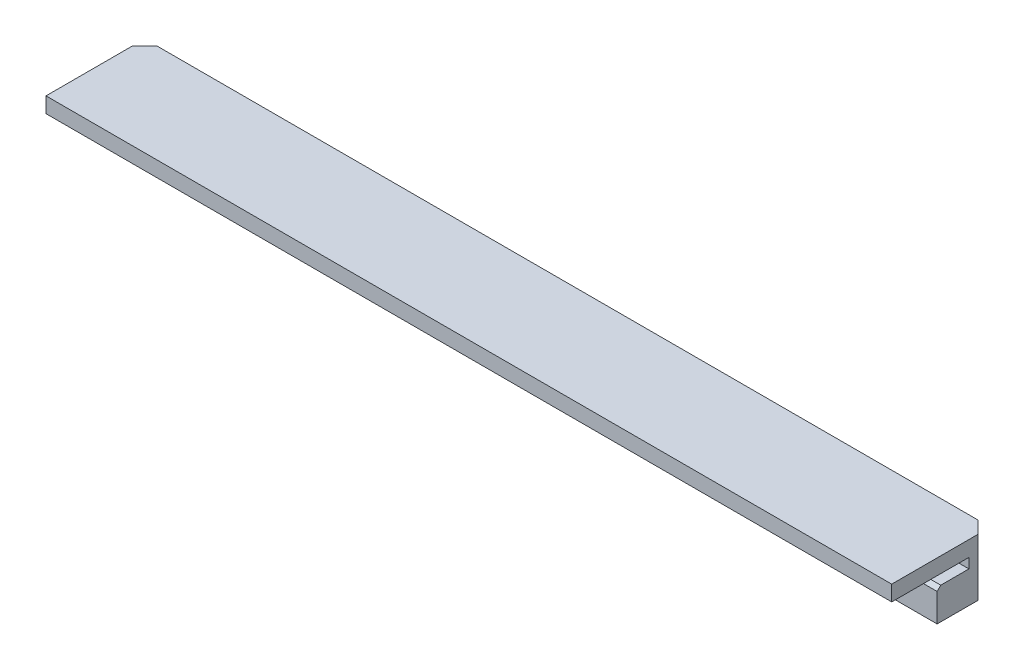
ISO-10303-21;
HEADER;
FILE_DESCRIPTION(('STEP AP214'),'2;1');
FILE_NAME('part.step','',(''),(''),'','','');
FILE_SCHEMA(('AUTOMOTIVE_DESIGN { 1 0 10303 214 1 1 1 1 }'));
ENDSEC;
DATA;
#1=APPLICATION_CONTEXT('core data for automotive mechanical design processes');
#2=APPLICATION_PROTOCOL_DEFINITION('international standard','automotive_design',2000,#1);
#3=PRODUCT_CONTEXT('',#1,'mechanical');
#4=PRODUCT('Part','Part','',(#3));
#5=PRODUCT_RELATED_PRODUCT_CATEGORY('part','',(#4));
#6=PRODUCT_DEFINITION_FORMATION('','',#4);
#7=PRODUCT_DEFINITION_CONTEXT('part definition',#1,'design');
#8=PRODUCT_DEFINITION('design','',#6,#7);
#9=PRODUCT_DEFINITION_SHAPE('','',#8);
#10=(LENGTH_UNIT() NAMED_UNIT(*) SI_UNIT(.MILLI.,.METRE.));
#11=(NAMED_UNIT(*) PLANE_ANGLE_UNIT() SI_UNIT($,.RADIAN.));
#12=(NAMED_UNIT(*) SI_UNIT($,.STERADIAN.) SOLID_ANGLE_UNIT());
#13=UNCERTAINTY_MEASURE_WITH_UNIT(LENGTH_MEASURE(1.E-05),#10,'distance_accuracy_value','');
#14=(GEOMETRIC_REPRESENTATION_CONTEXT(3) GLOBAL_UNCERTAINTY_ASSIGNED_CONTEXT((#13)) GLOBAL_UNIT_ASSIGNED_CONTEXT((#10,
#11,#12)) REPRESENTATION_CONTEXT('',''));
#15=CARTESIAN_POINT('',(0.,0.,0.));
#16=DIRECTION('',(0.,0.,1.));
#17=DIRECTION('',(1.,0.,0.));
#18=AXIS2_PLACEMENT_3D('',#15,#16,#17);
#19=CARTESIAN_POINT('',(0.,3.5,0.));
#20=DIRECTION('',(1.,0.,0.));
#21=DIRECTION('',(0.,0.,-1.));
#22=AXIS2_PLACEMENT_3D('',#19,#20,#21);
#23=PLANE('',#22);
#24=DIRECTION('',(0.,-1.,0.));
#25=VECTOR('',#24,1.);
#26=CARTESIAN_POINT('',(0.,6.301,-4.5));
#27=LINE('',#26,#25);
#28=CARTESIAN_POINT('',(0.,6.3,-4.5));
#29=VERTEX_POINT('',#28);
#30=CARTESIAN_POINT('',(0.,0.,-4.5));
#31=VERTEX_POINT('',#30);
#32=EDGE_CURVE('E167',#29,#31,#27,.T.);
#33=ORIENTED_EDGE('',*,*,#32,.T.);
#34=DIRECTION('',(0.,0.,1.));
#35=VECTOR('',#34,1.);
#36=CARTESIAN_POINT('',(0.,0.,0.));
#37=LINE('',#36,#35);
#38=CARTESIAN_POINT('',(0.,0.,0.));
#39=VERTEX_POINT('',#38);
#40=EDGE_CURVE('E177',#31,#39,#37,.T.);
#41=ORIENTED_EDGE('',*,*,#40,.T.);
#42=DIRECTION('',(0.,-1.,0.));
#43=VECTOR('',#42,1.);
#44=CARTESIAN_POINT('',(0.,3.5,0.));
#45=LINE('',#44,#43);
#46=CARTESIAN_POINT('',(0.,3.1,0.));
#47=VERTEX_POINT('',#46);
#48=EDGE_CURVE('E205',#47,#39,#45,.T.);
#49=ORIENTED_EDGE('',*,*,#48,.F.);
#50=DIRECTION('',(0.,-0.70710678118656,0.707106781186535));
#51=VECTOR('',#50,1.);
#52=CARTESIAN_POINT('',(0.,3.5,-0.399999999999984));
#53=LINE('',#52,#51);
#54=CARTESIAN_POINT('',(0.,3.5,-0.399999999999984));
#55=VERTEX_POINT('',#54);
#56=EDGE_CURVE('E215',#47,#55,#53,.F.);
#57=ORIENTED_EDGE('',*,*,#56,.T.);
#58=DIRECTION('',(0.,0.,1.));
#59=VECTOR('',#58,1.);
#60=CARTESIAN_POINT('',(0.,3.5,0.));
#61=LINE('',#60,#59);
#62=CARTESIAN_POINT('',(0.,3.5,-3.5));
#63=VERTEX_POINT('',#62);
#64=EDGE_CURVE('E201',#63,#55,#61,.T.);
#65=ORIENTED_EDGE('',*,*,#64,.F.);
#66=DIRECTION('',(0.,-1.,0.));
#67=VECTOR('',#66,1.);
#68=CARTESIAN_POINT('',(0.,4.6,-3.5));
#69=LINE('',#68,#67);
#70=CARTESIAN_POINT('',(0.,4.6,-3.5));
#71=VERTEX_POINT('',#70);
#72=EDGE_CURVE('E188',#71,#63,#69,.T.);
#73=ORIENTED_EDGE('',*,*,#72,.F.);
#74=DIRECTION('',(0.,0.,1.));
#75=VECTOR('',#74,1.);
#76=CARTESIAN_POINT('',(0.,4.6,-10.));
#77=LINE('',#76,#75);
#78=CARTESIAN_POINT('',(0.,4.6,5.));
#79=VERTEX_POINT('',#78);
#80=EDGE_CURVE('E257',#71,#79,#77,.T.);
#81=ORIENTED_EDGE('',*,*,#80,.T.);
#82=DIRECTION('',(0.,-1.,0.));
#83=VECTOR('',#82,1.);
#84=CARTESIAN_POINT('',(0.,4.6,5.));
#85=LINE('',#84,#83);
#86=CARTESIAN_POINT('',(0.,6.3,5.));
#87=VERTEX_POINT('',#86);
#88=EDGE_CURVE('E287',#87,#79,#85,.T.);
#89=ORIENTED_EDGE('',*,*,#88,.F.);
#90=DIRECTION('',(0.,0.,1.));
#91=VECTOR('',#90,1.);
#92=CARTESIAN_POINT('',(0.,6.3,5.));
#93=LINE('',#92,#91);
#94=EDGE_CURVE('E180',#29,#87,#93,.T.);
#95=ORIENTED_EDGE('',*,*,#94,.F.);
#96=EDGE_LOOP('',(#33,#41,#49,#57,#65,#73,#81,#89,#95));
#97=FACE_BOUND('',#96,.T.);
#98=ADVANCED_FACE('F41',(#97),#23,.F.);
#99=CARTESIAN_POINT('',(93.1,3.5,0.));
#100=DIRECTION('',(-1.,0.,0.));
#101=DIRECTION('',(0.,0.,1.));
#102=AXIS2_PLACEMENT_3D('',#99,#100,#101);
#103=PLANE('',#102);
#104=DIRECTION('',(0.,-1.,0.));
#105=VECTOR('',#104,1.);
#106=CARTESIAN_POINT('',(93.1,6.301,-4.50000000000001));
#107=LINE('',#106,#105);
#108=CARTESIAN_POINT('',(93.1,6.3,-4.50000000000001));
#109=VERTEX_POINT('',#108);
#110=CARTESIAN_POINT('',(93.1,0.,-4.50000000000001));
#111=VERTEX_POINT('',#110);
#112=EDGE_CURVE('E312',#109,#111,#107,.T.);
#113=ORIENTED_EDGE('',*,*,#112,.F.);
#114=DIRECTION('',(0.,0.,-1.));
#115=VECTOR('',#114,1.);
#116=CARTESIAN_POINT('',(93.1,6.3,5.));
#117=LINE('',#116,#115);
#118=CARTESIAN_POINT('',(93.1,6.3,5.));
#119=VERTEX_POINT('',#118);
#120=EDGE_CURVE('E298',#119,#109,#117,.T.);
#121=ORIENTED_EDGE('',*,*,#120,.F.);
#122=DIRECTION('',(0.,1.,0.));
#123=VECTOR('',#122,1.);
#124=CARTESIAN_POINT('',(93.1,4.6,5.));
#125=LINE('',#124,#123);
#126=CARTESIAN_POINT('',(93.1,4.6,5.));
#127=VERTEX_POINT('',#126);
#128=EDGE_CURVE('E284',#127,#119,#125,.T.);
#129=ORIENTED_EDGE('',*,*,#128,.F.);
#130=DIRECTION('',(0.,0.,-1.));
#131=VECTOR('',#130,1.);
#132=CARTESIAN_POINT('',(93.1,4.6,-10.));
#133=LINE('',#132,#131);
#134=CARTESIAN_POINT('',(93.1,4.6,-3.5));
#135=VERTEX_POINT('',#134);
#136=EDGE_CURVE('E254',#127,#135,#133,.T.);
#137=ORIENTED_EDGE('',*,*,#136,.T.);
#138=DIRECTION('',(0.,-1.,0.));
#139=VECTOR('',#138,1.);
#140=CARTESIAN_POINT('',(93.1,4.6,-3.5));
#141=LINE('',#140,#139);
#142=CARTESIAN_POINT('',(93.1,3.5,-3.5));
#143=VERTEX_POINT('',#142);
#144=EDGE_CURVE('E192',#135,#143,#141,.T.);
#145=ORIENTED_EDGE('',*,*,#144,.T.);
#146=DIRECTION('',(0.,0.,-1.));
#147=VECTOR('',#146,1.);
#148=CARTESIAN_POINT('',(93.1,3.5,0.));
#149=LINE('',#148,#147);
#150=CARTESIAN_POINT('',(93.1,3.5,-0.399999999999984));
#151=VERTEX_POINT('',#150);
#152=EDGE_CURVE('E195',#151,#143,#149,.T.);
#153=ORIENTED_EDGE('',*,*,#152,.F.);
#154=DIRECTION('',(0.,0.70710678118656,-0.707106781186535));
#155=VECTOR('',#154,1.);
#156=CARTESIAN_POINT('',(93.1,3.5,-0.399999999999984));
#157=LINE('',#156,#155);
#158=CARTESIAN_POINT('',(93.1,3.1,0.));
#159=VERTEX_POINT('',#158);
#160=EDGE_CURVE('E220',#151,#159,#157,.F.);
#161=ORIENTED_EDGE('',*,*,#160,.T.);
#162=DIRECTION('',(0.,-1.,0.));
#163=VECTOR('',#162,1.);
#164=CARTESIAN_POINT('',(93.1,3.5,0.));
#165=LINE('',#164,#163);
#166=CARTESIAN_POINT('',(93.1,0.,0.));
#167=VERTEX_POINT('',#166);
#168=EDGE_CURVE('E202',#159,#167,#165,.T.);
#169=ORIENTED_EDGE('',*,*,#168,.T.);
#170=DIRECTION('',(0.,0.,-1.));
#171=VECTOR('',#170,1.);
#172=CARTESIAN_POINT('',(93.1,0.,0.));
#173=LINE('',#172,#171);
#174=EDGE_CURVE('E198',#167,#111,#173,.T.);
#175=ORIENTED_EDGE('',*,*,#174,.T.);
#176=EDGE_LOOP('',(#113,#121,#129,#137,#145,#153,#161,#169,#175));
#177=FACE_BOUND('',#176,.T.);
#178=ADVANCED_FACE('F324',(#177),#103,.F.);
#179=CARTESIAN_POINT('',(0.,0.,0.));
#180=DIRECTION('',(0.,-1.,0.));
#181=DIRECTION('',(0.,0.,-1.));
#182=AXIS2_PLACEMENT_3D('',#179,#180,#181);
#183=PLANE('',#182);
#184=ORIENTED_EDGE('',*,*,#40,.F.);
#185=DIRECTION('',(0.707106781186548,0.,-0.707106781186548));
#186=VECTOR('',#185,1.);
#187=CARTESIAN_POINT('',(5.,0.,-9.5));
#188=LINE('',#187,#186);
#189=CARTESIAN_POINT('',(5.,0.,-9.5));
#190=VERTEX_POINT('',#189);
#191=EDGE_CURVE('E164',#31,#190,#188,.T.);
#192=ORIENTED_EDGE('',*,*,#191,.T.);
#193=DIRECTION('',(1.,0.,0.));
#194=VECTOR('',#193,1.);
#195=CARTESIAN_POINT('',(-0.001000000000001,0.,-9.5));
#196=LINE('',#195,#194);
#197=CARTESIAN_POINT('',(88.1,0.,-9.5));
#198=VERTEX_POINT('',#197);
#199=EDGE_CURVE('E301',#190,#198,#196,.T.);
#200=ORIENTED_EDGE('',*,*,#199,.T.);
#201=DIRECTION('',(0.707106781186547,0.,0.707106781186548));
#202=VECTOR('',#201,1.);
#203=CARTESIAN_POINT('',(88.1,0.,-9.50000000000001));
#204=LINE('',#203,#202);
#205=EDGE_CURVE('E57',#198,#111,#204,.T.);
#206=ORIENTED_EDGE('',*,*,#205,.T.);
#207=ORIENTED_EDGE('',*,*,#174,.F.);
#208=DIRECTION('',(1.,0.,0.));
#209=VECTOR('',#208,1.);
#210=CARTESIAN_POINT('',(0.,0.,0.));
#211=LINE('',#210,#209);
#212=CARTESIAN_POINT('',(76.399623113199,0.,0.));
#213=VERTEX_POINT('',#212);
#214=EDGE_CURVE('E187',#213,#167,#211,.T.);
#215=ORIENTED_EDGE('',*,*,#214,.F.);
#216=CARTESIAN_POINT('',(46.55,0.,147.));
#217=DIRECTION('',(0.,-1.,0.));
#218=DIRECTION('',(0.,0.,-1.));
#219=AXIS2_PLACEMENT_3D('',#216,#217,#218);
#220=CIRCLE('',#219,150.);
#221=CARTESIAN_POINT('',(16.7003768868009,0.,0.));
#222=VERTEX_POINT('',#221);
#223=EDGE_CURVE('E273',#222,#213,#220,.T.);
#224=ORIENTED_EDGE('',*,*,#223,.F.);
#225=EDGE_CURVE('E186',#39,#222,#211,.T.);
#226=ORIENTED_EDGE('',*,*,#225,.F.);
#227=EDGE_LOOP('',(#184,#192,#200,#206,#207,#215,#224,#226));
#228=FACE_BOUND('',#227,.T.);
#229=ADVANCED_FACE('F183',(#228),#183,.T.);
#230=CARTESIAN_POINT('',(-0.001000000000001,6.3,5.));
#231=DIRECTION('',(0.,-1.,0.));
#232=DIRECTION('',(0.,0.,-1.));
#233=AXIS2_PLACEMENT_3D('',#230,#231,#232);
#234=PLANE('',#233);
#235=DIRECTION('',(-0.707106781186548,0.,0.707106781186548));
#236=VECTOR('',#235,1.);
#237=CARTESIAN_POINT('',(5.,6.3,-9.5));
#238=LINE('',#237,#236);
#239=CARTESIAN_POINT('',(1.36269330410541,6.3,-5.86269330410541));
#240=VERTEX_POINT('',#239);
#241=EDGE_CURVE('E65',#240,#29,#238,.T.);
#242=ORIENTED_EDGE('',*,*,#241,.T.);
#243=ORIENTED_EDGE('',*,*,#94,.T.);
#244=DIRECTION('',(1.,0.,0.));
#245=VECTOR('',#244,1.);
#246=CARTESIAN_POINT('',(-0.001000000000001,6.3,5.));
#247=LINE('',#246,#245);
#248=EDGE_CURVE('E296',#87,#119,#247,.T.);
#249=ORIENTED_EDGE('',*,*,#248,.T.);
#250=ORIENTED_EDGE('',*,*,#120,.T.);
#251=DIRECTION('',(-0.707106781186547,0.,-0.707106781186548));
#252=VECTOR('',#251,1.);
#253=CARTESIAN_POINT('',(88.1,6.3,-9.50000000000001));
#254=LINE('',#253,#252);
#255=CARTESIAN_POINT('',(91.7373066958946,6.3,-5.86269330410541));
#256=VERTEX_POINT('',#255);
#257=EDGE_CURVE('E308',#109,#256,#254,.T.);
#258=ORIENTED_EDGE('',*,*,#257,.T.);
#259=DIRECTION('',(1.,0.,0.));
#260=VECTOR('',#259,1.);
#261=CARTESIAN_POINT('',(-0.001000000000001,6.3,-5.86269330410541));
#262=LINE('',#261,#260);
#263=EDGE_CURVE('E302',#240,#256,#262,.T.);
#264=ORIENTED_EDGE('',*,*,#263,.F.);
#265=EDGE_LOOP('',(#242,#243,#249,#250,#258,#264));
#266=FACE_BOUND('',#265,.T.);
#267=ADVANCED_FACE('F319',(#266),#234,.F.);
#268=CARTESIAN_POINT('',(-0.001000000000001,6.3,-5.86269330410541));
#269=DIRECTION('',(0.,-0.499999999999995,0.866025403784442));
#270=DIRECTION('',(0.,-0.866025403784442,-0.499999999999995));
#271=AXIS2_PLACEMENT_3D('',#268,#269,#270);
#272=PLANE('',#271);
#273=DIRECTION('',(-0.447213595499954,0.774596669241488,0.447213595499954));
#274=VECTOR('',#273,1.);
#275=CARTESIAN_POINT('',(2.81726957230171,3.78060000000004,-7.31726957230171));
#276=LINE('',#275,#274);
#277=EDGE_CURVE('E168',#190,#240,#276,.T.);
#278=ORIENTED_EDGE('',*,*,#277,.T.);
#279=ORIENTED_EDGE('',*,*,#263,.T.);
#280=DIRECTION('',(-0.447213595499954,-0.774596669241488,-0.447213595499954));
#281=VECTOR('',#280,1.);
#282=CARTESIAN_POINT('',(90.2827304276983,3.78060000000004,-7.31726957230171));
#283=LINE('',#282,#281);
#284=EDGE_CURVE('E306',#256,#198,#283,.T.);
#285=ORIENTED_EDGE('',*,*,#284,.T.);
#286=ORIENTED_EDGE('',*,*,#199,.F.);
#287=EDGE_LOOP('',(#278,#279,#285,#286));
#288=FACE_BOUND('',#287,.T.);
#289=ADVANCED_FACE('F317',(#288),#272,.F.);
#290=CARTESIAN_POINT('',(0.,3.5,0.));
#291=DIRECTION('',(0.,0.,-1.));
#292=DIRECTION('',(-1.,0.,0.));
#293=AXIS2_PLACEMENT_3D('',#290,#291,#292);
#294=PLANE('',#293);
#295=DIRECTION('',(0.,-1.,0.));
#296=VECTOR('',#295,1.);
#297=CARTESIAN_POINT('',(88.1,4.6,0.));
#298=LINE('',#297,#296);
#299=CARTESIAN_POINT('',(88.1,4.6,0.));
#300=VERTEX_POINT('',#299);
#301=CARTESIAN_POINT('',(88.1,3.1,0.));
#302=VERTEX_POINT('',#301);
#303=EDGE_CURVE('E261',#300,#302,#298,.T.);
#304=ORIENTED_EDGE('',*,*,#303,.F.);
#305=DIRECTION('',(1.,0.,0.));
#306=VECTOR('',#305,1.);
#307=CARTESIAN_POINT('',(0.,4.6,0.));
#308=LINE('',#307,#306);
#309=CARTESIAN_POINT('',(76.399623113199,4.6,0.));
#310=VERTEX_POINT('',#309);
#311=EDGE_CURVE('E288',#310,#300,#308,.T.);
#312=ORIENTED_EDGE('',*,*,#311,.F.);
#313=DIRECTION('',(0.,-1.,0.));
#314=VECTOR('',#313,1.);
#315=CARTESIAN_POINT('',(76.399623113199,6.601,0.));
#316=LINE('',#315,#314);
#317=EDGE_CURVE('E277',#213,#310,#316,.F.);
#318=ORIENTED_EDGE('',*,*,#317,.F.);
#319=ORIENTED_EDGE('',*,*,#214,.T.);
#320=ORIENTED_EDGE('',*,*,#168,.F.);
#321=DIRECTION('',(-1.,0.,0.));
#322=VECTOR('',#321,1.);
#323=CARTESIAN_POINT('',(0.,3.1,0.));
#324=LINE('',#323,#322);
#325=EDGE_CURVE('E210',#159,#302,#324,.T.);
#326=ORIENTED_EDGE('',*,*,#325,.T.);
#327=EDGE_LOOP('',(#304,#312,#318,#319,#320,#326));
#328=FACE_BOUND('',#327,.T.);
#329=ADVANCED_FACE('F332',(#328),#294,.F.);
#330=CARTESIAN_POINT('',(0.,3.5,0.));
#331=DIRECTION('',(0.,-1.,0.));
#332=DIRECTION('',(0.,0.,-1.));
#333=AXIS2_PLACEMENT_3D('',#330,#331,#332);
#334=PLANE('',#333);
#335=DIRECTION('',(0.,0.,-1.));
#336=VECTOR('',#335,1.);
#337=CARTESIAN_POINT('',(88.1,3.5,83.1072800661891));
#338=LINE('',#337,#336);
#339=CARTESIAN_POINT('',(88.1,3.5,-0.399999999999984));
#340=VERTEX_POINT('',#339);
#341=CARTESIAN_POINT('',(88.1,3.5,-3.5));
#342=VERTEX_POINT('',#341);
#343=EDGE_CURVE('E262',#340,#342,#338,.T.);
#344=ORIENTED_EDGE('',*,*,#343,.F.);
#345=DIRECTION('',(1.,0.,0.));
#346=VECTOR('',#345,1.);
#347=CARTESIAN_POINT('',(0.,3.5,-0.399999999999984));
#348=LINE('',#347,#346);
#349=EDGE_CURVE('E217',#340,#151,#348,.T.);
#350=ORIENTED_EDGE('',*,*,#349,.T.);
#351=ORIENTED_EDGE('',*,*,#152,.T.);
#352=DIRECTION('',(1.,0.,0.));
#353=VECTOR('',#352,1.);
#354=CARTESIAN_POINT('',(0.,3.5,-3.5));
#355=LINE('',#354,#353);
#356=EDGE_CURVE('E251',#342,#143,#355,.T.);
#357=ORIENTED_EDGE('',*,*,#356,.F.);
#358=EDGE_LOOP('',(#344,#350,#351,#357));
#359=FACE_BOUND('',#358,.T.);
#360=ADVANCED_FACE('F358',(#359),#334,.F.);
#361=ORIENTED_EDGE('',*,*,#64,.T.);
#362=DIRECTION('',(1.,0.,0.));
#363=VECTOR('',#362,1.);
#364=CARTESIAN_POINT('',(0.,3.5,-0.399999999999984));
#365=LINE('',#364,#363);
#366=CARTESIAN_POINT('',(5.,3.5,-0.399999999999984));
#367=VERTEX_POINT('',#366);
#368=EDGE_CURVE('E207',#55,#367,#365,.T.);
#369=ORIENTED_EDGE('',*,*,#368,.T.);
#370=DIRECTION('',(0.,0.,-1.));
#371=VECTOR('',#370,1.);
#372=CARTESIAN_POINT('',(5.,3.5,83.1072800661891));
#373=LINE('',#372,#371);
#374=CARTESIAN_POINT('',(5.,3.5,-3.5));
#375=VERTEX_POINT('',#374);
#376=EDGE_CURVE('E230',#367,#375,#373,.T.);
#377=ORIENTED_EDGE('',*,*,#376,.T.);
#378=EDGE_CURVE('E244',#63,#375,#355,.T.);
#379=ORIENTED_EDGE('',*,*,#378,.F.);
#380=EDGE_LOOP('',(#361,#369,#377,#379));
#381=FACE_BOUND('',#380,.T.);
#382=ADVANCED_FACE('F242',(#381),#334,.F.);
#383=CARTESIAN_POINT('',(0.,4.6,-3.5));
#384=DIRECTION('',(0.,0.,-1.));
#385=DIRECTION('',(-1.,0.,0.));
#386=AXIS2_PLACEMENT_3D('',#383,#384,#385);
#387=PLANE('',#386);
#388=DIRECTION('',(0.,1.,0.));
#389=VECTOR('',#388,1.);
#390=CARTESIAN_POINT('',(88.1,4.6,-3.5));
#391=LINE('',#390,#389);
#392=CARTESIAN_POINT('',(88.1,4.6,-3.5));
#393=VERTEX_POINT('',#392);
#394=EDGE_CURVE('E269',#342,#393,#391,.T.);
#395=ORIENTED_EDGE('',*,*,#394,.F.);
#396=ORIENTED_EDGE('',*,*,#356,.T.);
#397=ORIENTED_EDGE('',*,*,#144,.F.);
#398=DIRECTION('',(1.,0.,0.));
#399=VECTOR('',#398,1.);
#400=CARTESIAN_POINT('',(0.,4.6,-3.5));
#401=LINE('',#400,#399);
#402=EDGE_CURVE('E250',#393,#135,#401,.T.);
#403=ORIENTED_EDGE('',*,*,#402,.F.);
#404=EDGE_LOOP('',(#395,#396,#397,#403));
#405=FACE_BOUND('',#404,.T.);
#406=ADVANCED_FACE('F354',(#405),#387,.F.);
#407=DIRECTION('',(0.,-1.,0.));
#408=VECTOR('',#407,1.);
#409=CARTESIAN_POINT('',(5.,4.6,-3.5));
#410=LINE('',#409,#408);
#411=CARTESIAN_POINT('',(5.,4.6,-3.5));
#412=VERTEX_POINT('',#411);
#413=EDGE_CURVE('E271',#412,#375,#410,.T.);
#414=ORIENTED_EDGE('',*,*,#413,.F.);
#415=EDGE_CURVE('E248',#71,#412,#401,.T.);
#416=ORIENTED_EDGE('',*,*,#415,.F.);
#417=ORIENTED_EDGE('',*,*,#72,.T.);
#418=ORIENTED_EDGE('',*,*,#378,.T.);
#419=EDGE_LOOP('',(#414,#416,#417,#418));
#420=FACE_BOUND('',#419,.T.);
#421=ADVANCED_FACE('F343',(#420),#387,.F.);
#422=CARTESIAN_POINT('',(0.,4.6,0.));
#423=DIRECTION('',(0.,1.,0.));
#424=DIRECTION('',(0.,0.,1.));
#425=AXIS2_PLACEMENT_3D('',#422,#423,#424);
#426=PLANE('',#425);
#427=DIRECTION('',(0.,0.,-1.));
#428=VECTOR('',#427,1.);
#429=CARTESIAN_POINT('',(5.,4.6,83.1072800661891));
#430=LINE('',#429,#428);
#431=CARTESIAN_POINT('',(5.,4.6,0.));
#432=VERTEX_POINT('',#431);
#433=EDGE_CURVE('E267',#432,#412,#430,.T.);
#434=ORIENTED_EDGE('',*,*,#433,.F.);
#435=CARTESIAN_POINT('',(16.7003768868009,4.6,0.));
#436=VERTEX_POINT('',#435);
#437=EDGE_CURVE('E285',#432,#436,#308,.T.);
#438=ORIENTED_EDGE('',*,*,#437,.T.);
#439=CARTESIAN_POINT('',(46.55,4.6,147.));
#440=DIRECTION('',(0.,-1.,0.));
#441=DIRECTION('',(0.,0.,-1.));
#442=AXIS2_PLACEMENT_3D('',#439,#440,#441);
#443=CIRCLE('',#442,150.);
#444=EDGE_CURVE('E282',#436,#310,#443,.T.);
#445=ORIENTED_EDGE('',*,*,#444,.T.);
#446=ORIENTED_EDGE('',*,*,#311,.T.);
#447=DIRECTION('',(0.,0.,-1.));
#448=VECTOR('',#447,1.);
#449=CARTESIAN_POINT('',(88.1,4.6,83.1072800661891));
#450=LINE('',#449,#448);
#451=EDGE_CURVE('E264',#300,#393,#450,.T.);
#452=ORIENTED_EDGE('',*,*,#451,.T.);
#453=ORIENTED_EDGE('',*,*,#402,.T.);
#454=ORIENTED_EDGE('',*,*,#136,.F.);
#455=DIRECTION('',(1.,0.,0.));
#456=VECTOR('',#455,1.);
#457=CARTESIAN_POINT('',(0.,4.6,5.));
#458=LINE('',#457,#456);
#459=EDGE_CURVE('E291',#79,#127,#458,.T.);
#460=ORIENTED_EDGE('',*,*,#459,.F.);
#461=ORIENTED_EDGE('',*,*,#80,.F.);
#462=ORIENTED_EDGE('',*,*,#415,.T.);
#463=EDGE_LOOP('',(#434,#438,#445,#446,#452,#453,#454,#460,#461,#462));
#464=FACE_BOUND('',#463,.T.);
#465=ADVANCED_FACE('F339',(#464),#426,.F.);
#466=DIRECTION('',(0.,-1.,0.));
#467=VECTOR('',#466,1.);
#468=CARTESIAN_POINT('',(16.7003768868009,6.601,0.));
#469=LINE('',#468,#467);
#470=EDGE_CURVE('E280',#436,#222,#469,.T.);
#471=ORIENTED_EDGE('',*,*,#470,.F.);
#472=ORIENTED_EDGE('',*,*,#437,.F.);
#473=DIRECTION('',(0.,1.,0.));
#474=VECTOR('',#473,1.);
#475=CARTESIAN_POINT('',(5.,4.6,0.));
#476=LINE('',#475,#474);
#477=CARTESIAN_POINT('',(5.,3.1,0.));
#478=VERTEX_POINT('',#477);
#479=EDGE_CURVE('E227',#478,#432,#476,.T.);
#480=ORIENTED_EDGE('',*,*,#479,.F.);
#481=DIRECTION('',(-1.,0.,0.));
#482=VECTOR('',#481,1.);
#483=CARTESIAN_POINT('',(0.,3.1,0.));
#484=LINE('',#483,#482);
#485=EDGE_CURVE('E213',#478,#47,#484,.T.);
#486=ORIENTED_EDGE('',*,*,#485,.T.);
#487=ORIENTED_EDGE('',*,*,#48,.T.);
#488=ORIENTED_EDGE('',*,*,#225,.T.);
#489=EDGE_LOOP('',(#471,#472,#480,#486,#487,#488));
#490=FACE_BOUND('',#489,.T.);
#491=ADVANCED_FACE('F237',(#490),#294,.F.);
#492=CARTESIAN_POINT('',(88.1,4.6,83.1072800661891));
#493=DIRECTION('',(-1.,0.,0.));
#494=DIRECTION('',(0.,0.,1.));
#495=AXIS2_PLACEMENT_3D('',#492,#493,#494);
#496=PLANE('',#495);
#497=ORIENTED_EDGE('',*,*,#451,.F.);
#498=ORIENTED_EDGE('',*,*,#303,.T.);
#499=DIRECTION('',(0.,-0.70710678118656,0.707106781186535));
#500=VECTOR('',#499,1.);
#501=CARTESIAN_POINT('',(88.1,-37.7036400330945,40.8036400330931));
#502=LINE('',#501,#500);
#503=EDGE_CURVE('E11',#302,#340,#502,.F.);
#504=ORIENTED_EDGE('',*,*,#503,.T.);
#505=ORIENTED_EDGE('',*,*,#343,.T.);
#506=ORIENTED_EDGE('',*,*,#394,.T.);
#507=EDGE_LOOP('',(#497,#498,#504,#505,#506));
#508=FACE_BOUND('',#507,.T.);
#509=ADVANCED_FACE('F364',(#508),#496,.F.);
#510=CARTESIAN_POINT('',(5.,4.6,83.1072800661891));
#511=DIRECTION('',(1.,0.,0.));
#512=DIRECTION('',(0.,0.,-1.));
#513=AXIS2_PLACEMENT_3D('',#510,#511,#512);
#514=PLANE('',#513);
#515=ORIENTED_EDGE('',*,*,#376,.F.);
#516=DIRECTION('',(0.,0.70710678118656,-0.707106781186535));
#517=VECTOR('',#516,1.);
#518=CARTESIAN_POINT('',(5.,-37.7036400330945,40.8036400330931));
#519=LINE('',#518,#517);
#520=EDGE_CURVE('E50',#367,#478,#519,.F.);
#521=ORIENTED_EDGE('',*,*,#520,.T.);
#522=ORIENTED_EDGE('',*,*,#479,.T.);
#523=ORIENTED_EDGE('',*,*,#433,.T.);
#524=ORIENTED_EDGE('',*,*,#413,.T.);
#525=EDGE_LOOP('',(#515,#521,#522,#523,#524));
#526=FACE_BOUND('',#525,.T.);
#527=ADVANCED_FACE('F226',(#526),#514,.F.);
#528=CARTESIAN_POINT('',(0.,3.5,-0.399999999999984));
#529=DIRECTION('',(0.,-0.707106781186535,-0.70710678118656));
#530=DIRECTION('',(1.,0.,0.));
#531=AXIS2_PLACEMENT_3D('',#528,#529,#530);
#532=PLANE('',#531);
#533=ORIENTED_EDGE('',*,*,#56,.F.);
#534=ORIENTED_EDGE('',*,*,#485,.F.);
#535=ORIENTED_EDGE('',*,*,#520,.F.);
#536=ORIENTED_EDGE('',*,*,#368,.F.);
#537=EDGE_LOOP('',(#533,#534,#535,#536));
#538=FACE_BOUND('',#537,.T.);
#539=ADVANCED_FACE('F234',(#538),#532,.F.);
#540=CARTESIAN_POINT('',(0.,3.5,-0.399999999999984));
#541=DIRECTION('',(0.,-0.707106781186535,-0.70710678118656));
#542=DIRECTION('',(1.,0.,0.));
#543=AXIS2_PLACEMENT_3D('',#540,#541,#542);
#544=PLANE('',#543);
#545=ORIENTED_EDGE('',*,*,#503,.F.);
#546=ORIENTED_EDGE('',*,*,#325,.F.);
#547=ORIENTED_EDGE('',*,*,#160,.F.);
#548=ORIENTED_EDGE('',*,*,#349,.F.);
#549=EDGE_LOOP('',(#545,#546,#547,#548));
#550=FACE_BOUND('',#549,.T.);
#551=ADVANCED_FACE('F44',(#550),#544,.F.);
#552=CARTESIAN_POINT('',(46.55,6.601,147.));
#553=DIRECTION('',(0.,-1.,0.));
#554=DIRECTION('',(0.,0.,-1.));
#555=AXIS2_PLACEMENT_3D('',#552,#553,#554);
#556=CYLINDRICAL_SURFACE('',#555,150.);
#557=ORIENTED_EDGE('',*,*,#317,.T.);
#558=ORIENTED_EDGE('',*,*,#444,.F.);
#559=ORIENTED_EDGE('',*,*,#470,.T.);
#560=ORIENTED_EDGE('',*,*,#223,.T.);
#561=EDGE_LOOP('',(#557,#558,#559,#560));
#562=FACE_BOUND('',#561,.T.);
#563=ADVANCED_FACE('F337',(#562),#556,.F.);
#564=CARTESIAN_POINT('',(0.,0.,5.));
#565=DIRECTION('',(0.,0.,-1.));
#566=DIRECTION('',(-1.,0.,0.));
#567=AXIS2_PLACEMENT_3D('',#564,#565,#566);
#568=PLANE('',#567);
#569=ORIENTED_EDGE('',*,*,#128,.T.);
#570=ORIENTED_EDGE('',*,*,#248,.F.);
#571=ORIENTED_EDGE('',*,*,#88,.T.);
#572=ORIENTED_EDGE('',*,*,#459,.T.);
#573=EDGE_LOOP('',(#569,#570,#571,#572));
#574=FACE_BOUND('',#573,.T.);
#575=ADVANCED_FACE('F346',(#574),#568,.F.);
#576=CARTESIAN_POINT('',(88.1,6.301,-9.50000000000001));
#577=DIRECTION('',(0.707106781186548,0.,-0.707106781186547));
#578=DIRECTION('',(-0.707106781186547,0.,-0.707106781186548));
#579=AXIS2_PLACEMENT_3D('',#576,#577,#578);
#580=PLANE('',#579);
#581=ORIENTED_EDGE('',*,*,#112,.T.);
#582=ORIENTED_EDGE('',*,*,#205,.F.);
#583=ORIENTED_EDGE('',*,*,#284,.F.);
#584=ORIENTED_EDGE('',*,*,#257,.F.);
#585=EDGE_LOOP('',(#581,#582,#583,#584));
#586=FACE_BOUND('',#585,.T.);
#587=ADVANCED_FACE('F322',(#586),#580,.T.);
#588=CARTESIAN_POINT('',(5.,6.301,-9.5));
#589=DIRECTION('',(-0.707106781186547,0.,-0.707106781186547));
#590=DIRECTION('',(-0.707106781186548,0.,0.707106781186548));
#591=AXIS2_PLACEMENT_3D('',#588,#589,#590);
#592=PLANE('',#591);
#593=ORIENTED_EDGE('',*,*,#277,.F.);
#594=ORIENTED_EDGE('',*,*,#191,.F.);
#595=ORIENTED_EDGE('',*,*,#32,.F.);
#596=ORIENTED_EDGE('',*,*,#241,.F.);
#597=EDGE_LOOP('',(#593,#594,#595,#596));
#598=FACE_BOUND('',#597,.T.);
#599=ADVANCED_FACE('F166',(#598),#592,.T.);
#600=CLOSED_SHELL('',(#98,#178,#229,#267,#289,#329,#360,#382,#406,#421,#465,#491,#509,#527,#539,
#551,#563,#575,#587,#599));
#601=MANIFOLD_SOLID_BREP('B2',#600);
#602=ADVANCED_BREP_SHAPE_REPRESENTATION('',(#18,#601),#14);
#603=SHAPE_DEFINITION_REPRESENTATION(#9,#602);
ENDSEC;
END-ISO-10303-21;
